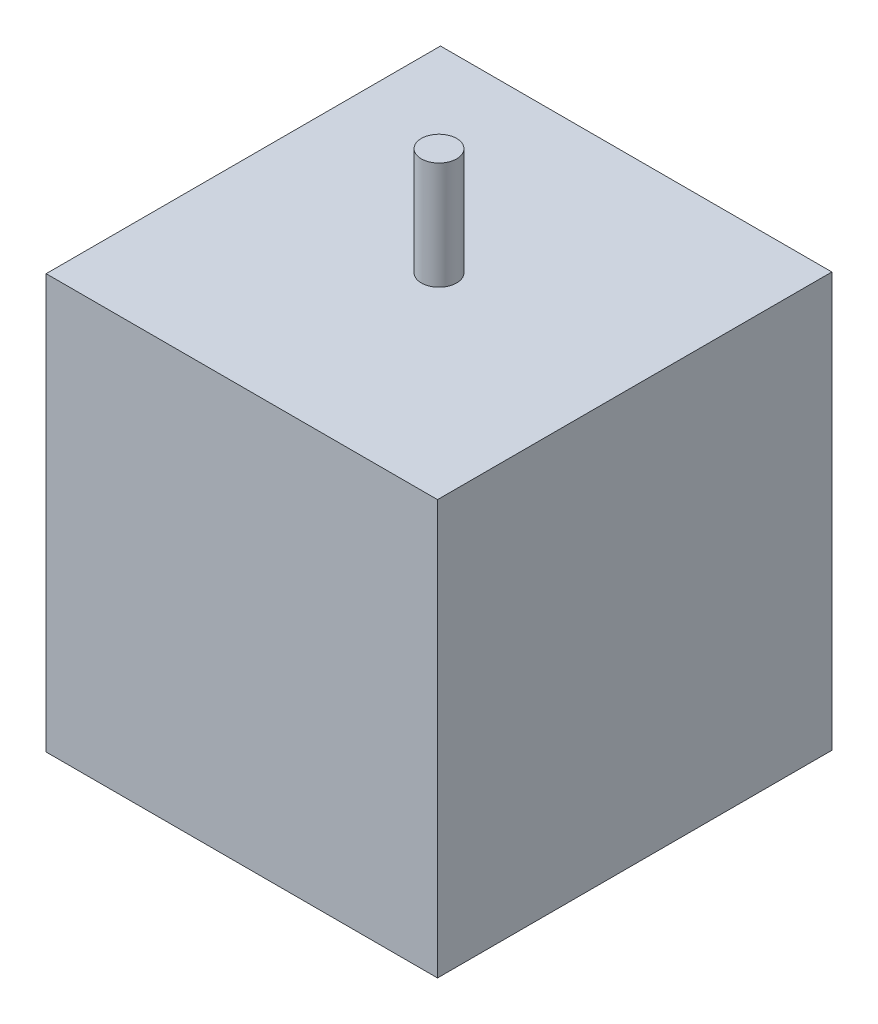
ISO-10303-21;
HEADER;
FILE_DESCRIPTION(('STEP AP214'),'2;1');
FILE_NAME('part.step','',(''),(''),'','','');
FILE_SCHEMA(('AUTOMOTIVE_DESIGN { 1 0 10303 214 1 1 1 1 }'));
ENDSEC;
DATA;
#1=APPLICATION_CONTEXT('core data for automotive mechanical design processes');
#2=APPLICATION_PROTOCOL_DEFINITION('international standard','automotive_design',2000,#1);
#3=PRODUCT_CONTEXT('',#1,'mechanical');
#4=PRODUCT('Part','Part','',(#3));
#5=PRODUCT_RELATED_PRODUCT_CATEGORY('part','',(#4));
#6=PRODUCT_DEFINITION_FORMATION('','',#4);
#7=PRODUCT_DEFINITION_CONTEXT('part definition',#1,'design');
#8=PRODUCT_DEFINITION('design','',#6,#7);
#9=PRODUCT_DEFINITION_SHAPE('','',#8);
#10=(LENGTH_UNIT() NAMED_UNIT(*) SI_UNIT(.MILLI.,.METRE.));
#11=(NAMED_UNIT(*) PLANE_ANGLE_UNIT() SI_UNIT($,.RADIAN.));
#12=(NAMED_UNIT(*) SI_UNIT($,.STERADIAN.) SOLID_ANGLE_UNIT());
#13=UNCERTAINTY_MEASURE_WITH_UNIT(LENGTH_MEASURE(1.E-05),#10,'distance_accuracy_value','');
#14=(GEOMETRIC_REPRESENTATION_CONTEXT(3) GLOBAL_UNCERTAINTY_ASSIGNED_CONTEXT((#13)) GLOBAL_UNIT_ASSIGNED_CONTEXT((#10,
#11,#12)) REPRESENTATION_CONTEXT('',''));
#15=CARTESIAN_POINT('',(0.,0.,0.));
#16=DIRECTION('',(0.,0.,1.));
#17=DIRECTION('',(1.,0.,0.));
#18=AXIS2_PLACEMENT_3D('',#15,#16,#17);
#19=CARTESIAN_POINT('',(49.8504423582809,115.560150299161,110.));
#20=DIRECTION('',(1.,0.,0.));
#21=DIRECTION('',(0.,1.,0.));
#22=AXIS2_PLACEMENT_3D('',#19,#20,#21);
#23=PLANE('',#22);
#24=DIRECTION('',(0.,-1.,0.));
#25=VECTOR('',#24,1.);
#26=CARTESIAN_POINT('',(49.8504423582809,115.560150299161,0.));
#27=LINE('',#26,#25);
#28=CARTESIAN_POINT('',(49.8504423582809,115.560150299161,0.));
#29=VERTEX_POINT('',#28);
#30=CARTESIAN_POINT('',(49.8504423582809,0.,0.));
#31=VERTEX_POINT('',#30);
#32=EDGE_CURVE('E109',#29,#31,#27,.T.);
#33=ORIENTED_EDGE('',*,*,#32,.T.);
#34=DIRECTION('',(0.,0.,-1.));
#35=VECTOR('',#34,1.);
#36=CARTESIAN_POINT('',(49.8504423582809,0.,110.));
#37=LINE('',#36,#35);
#38=CARTESIAN_POINT('',(49.8504423582809,0.,110.));
#39=VERTEX_POINT('',#38);
#40=EDGE_CURVE('E100',#39,#31,#37,.T.);
#41=ORIENTED_EDGE('',*,*,#40,.F.);
#42=DIRECTION('',(0.,-1.,0.));
#43=VECTOR('',#42,1.);
#44=CARTESIAN_POINT('',(49.8504423582809,115.560150299161,110.));
#45=LINE('',#44,#43);
#46=CARTESIAN_POINT('',(49.8504423582809,115.560150299161,110.));
#47=VERTEX_POINT('',#46);
#48=EDGE_CURVE('E94',#47,#39,#45,.T.);
#49=ORIENTED_EDGE('',*,*,#48,.F.);
#50=DIRECTION('',(0.,0.,-1.));
#51=VECTOR('',#50,1.);
#52=CARTESIAN_POINT('',(49.8504423582809,115.560150299161,110.));
#53=LINE('',#52,#51);
#54=EDGE_CURVE('E105',#47,#29,#53,.T.);
#55=ORIENTED_EDGE('',*,*,#54,.T.);
#56=EDGE_LOOP('',(#33,#41,#49,#55));
#57=FACE_BOUND('',#56,.T.);
#58=ADVANCED_FACE('F41',(#57),#23,.F.);
#59=CARTESIAN_POINT('',(49.8504423582809,0.,110.));
#60=DIRECTION('',(0.,1.,0.));
#61=DIRECTION('',(0.,0.,1.));
#62=AXIS2_PLACEMENT_3D('',#59,#60,#61);
#63=PLANE('',#62);
#64=CARTESIAN_POINT('',(104.436974974676,0.,55.));
#65=DIRECTION('',(0.,1.,0.));
#66=DIRECTION('',(0.,0.,1.));
#67=AXIS2_PLACEMENT_3D('',#64,#65,#66);
#68=CIRCLE('',#67,4.9273067198946);
#69=CARTESIAN_POINT('',(104.436974974676,0.,59.9273067198946));
#70=VERTEX_POINT('',#69);
#71=EDGE_CURVE('E11',#70,#70,#68,.F.);
#72=ORIENTED_EDGE('',*,*,#71,.F.);
#73=EDGE_LOOP('',(#72));
#74=FACE_BOUND('',#73,.T.);
#75=DIRECTION('',(1.,0.,0.));
#76=VECTOR('',#75,1.);
#77=CARTESIAN_POINT('',(49.8504423582809,0.,0.));
#78=LINE('',#77,#76);
#79=CARTESIAN_POINT('',(159.023507591071,0.,0.));
#80=VERTEX_POINT('',#79);
#81=EDGE_CURVE('E99',#31,#80,#78,.T.);
#82=ORIENTED_EDGE('',*,*,#81,.T.);
#83=DIRECTION('',(0.,0.,-1.));
#84=VECTOR('',#83,1.);
#85=CARTESIAN_POINT('',(159.023507591071,0.,110.));
#86=LINE('',#85,#84);
#87=CARTESIAN_POINT('',(159.023507591071,0.,110.));
#88=VERTEX_POINT('',#87);
#89=EDGE_CURVE('E97',#88,#80,#86,.T.);
#90=ORIENTED_EDGE('',*,*,#89,.F.);
#91=DIRECTION('',(1.,0.,0.));
#92=VECTOR('',#91,1.);
#93=CARTESIAN_POINT('',(49.8504423582809,0.,110.));
#94=LINE('',#93,#92);
#95=EDGE_CURVE('E89',#39,#88,#94,.T.);
#96=ORIENTED_EDGE('',*,*,#95,.F.);
#97=ORIENTED_EDGE('',*,*,#40,.T.);
#98=EDGE_LOOP('',(#82,#90,#96,#97));
#99=FACE_BOUND('',#98,.T.);
#100=ADVANCED_FACE('F98',(#74,#99),#63,.F.);
#101=CARTESIAN_POINT('',(159.023507591071,115.560150299161,110.));
#102=DIRECTION('',(-1.,0.,0.));
#103=DIRECTION('',(0.,0.,1.));
#104=AXIS2_PLACEMENT_3D('',#101,#102,#103);
#105=PLANE('',#104);
#106=DIRECTION('',(0.,1.,0.));
#107=VECTOR('',#106,1.);
#108=CARTESIAN_POINT('',(159.023507591071,115.560150299161,0.));
#109=LINE('',#108,#107);
#110=CARTESIAN_POINT('',(159.023507591071,115.560150299161,0.));
#111=VERTEX_POINT('',#110);
#112=EDGE_CURVE('E75',#80,#111,#109,.T.);
#113=ORIENTED_EDGE('',*,*,#112,.T.);
#114=DIRECTION('',(0.,0.,-1.));
#115=VECTOR('',#114,1.);
#116=CARTESIAN_POINT('',(159.023507591071,115.560150299161,110.));
#117=LINE('',#116,#115);
#118=CARTESIAN_POINT('',(159.023507591071,115.560150299161,110.));
#119=VERTEX_POINT('',#118);
#120=EDGE_CURVE('E101',#119,#111,#117,.T.);
#121=ORIENTED_EDGE('',*,*,#120,.F.);
#122=DIRECTION('',(0.,1.,0.));
#123=VECTOR('',#122,1.);
#124=CARTESIAN_POINT('',(159.023507591071,115.560150299161,110.));
#125=LINE('',#124,#123);
#126=EDGE_CURVE('E92',#88,#119,#125,.T.);
#127=ORIENTED_EDGE('',*,*,#126,.F.);
#128=ORIENTED_EDGE('',*,*,#89,.T.);
#129=EDGE_LOOP('',(#113,#121,#127,#128));
#130=FACE_BOUND('',#129,.T.);
#131=ADVANCED_FACE('F103',(#130),#105,.F.);
#132=CARTESIAN_POINT('',(49.8504423582809,115.560150299161,110.));
#133=DIRECTION('',(0.,-1.,0.));
#134=DIRECTION('',(0.,0.,-1.));
#135=AXIS2_PLACEMENT_3D('',#132,#133,#134);
#136=PLANE('',#135);
#137=CARTESIAN_POINT('',(104.436974974676,115.560150299161,55.));
#138=DIRECTION('',(0.,-1.,0.));
#139=DIRECTION('',(0.,0.,-1.));
#140=AXIS2_PLACEMENT_3D('',#137,#138,#139);
#141=CIRCLE('',#140,4.9273067198946);
#142=CARTESIAN_POINT('',(104.436974974676,115.560150299161,50.0726932801054));
#143=VERTEX_POINT('',#142);
#144=EDGE_CURVE('E44',#143,#143,#141,.F.);
#145=ORIENTED_EDGE('',*,*,#144,.F.);
#146=EDGE_LOOP('',(#145));
#147=FACE_BOUND('',#146,.T.);
#148=DIRECTION('',(-1.,0.,0.));
#149=VECTOR('',#148,1.);
#150=CARTESIAN_POINT('',(49.8504423582809,115.560150299161,0.));
#151=LINE('',#150,#149);
#152=EDGE_CURVE('E81',#111,#29,#151,.T.);
#153=ORIENTED_EDGE('',*,*,#152,.T.);
#154=ORIENTED_EDGE('',*,*,#54,.F.);
#155=DIRECTION('',(-1.,0.,0.));
#156=VECTOR('',#155,1.);
#157=CARTESIAN_POINT('',(49.8504423582809,115.560150299161,110.));
#158=LINE('',#157,#156);
#159=EDGE_CURVE('E58',#119,#47,#158,.T.);
#160=ORIENTED_EDGE('',*,*,#159,.F.);
#161=ORIENTED_EDGE('',*,*,#120,.T.);
#162=EDGE_LOOP('',(#153,#154,#160,#161));
#163=FACE_BOUND('',#162,.T.);
#164=ADVANCED_FACE('F122',(#147,#163),#136,.F.);
#165=CARTESIAN_POINT('',(0.,0.,110.));
#166=DIRECTION('',(0.,0.,1.));
#167=DIRECTION('',(1.,0.,0.));
#168=AXIS2_PLACEMENT_3D('',#165,#166,#167);
#169=PLANE('',#168);
#170=ORIENTED_EDGE('',*,*,#48,.T.);
#171=ORIENTED_EDGE('',*,*,#95,.T.);
#172=ORIENTED_EDGE('',*,*,#126,.T.);
#173=ORIENTED_EDGE('',*,*,#159,.T.);
#174=EDGE_LOOP('',(#170,#171,#172,#173));
#175=FACE_BOUND('',#174,.T.);
#176=ADVANCED_FACE('F90',(#175),#169,.T.);
#177=CARTESIAN_POINT('',(0.,0.,0.));
#178=DIRECTION('',(0.,0.,1.));
#179=DIRECTION('',(1.,0.,0.));
#180=AXIS2_PLACEMENT_3D('',#177,#178,#179);
#181=PLANE('',#180);
#182=ORIENTED_EDGE('',*,*,#32,.F.);
#183=ORIENTED_EDGE('',*,*,#152,.F.);
#184=ORIENTED_EDGE('',*,*,#112,.F.);
#185=ORIENTED_EDGE('',*,*,#81,.F.);
#186=EDGE_LOOP('',(#182,#183,#184,#185));
#187=FACE_BOUND('',#186,.T.);
#188=ADVANCED_FACE('F130',(#187),#181,.F.);
#189=CARTESIAN_POINT('',(104.436974974676,145.560150299161,55.));
#190=DIRECTION('',(0.,1.,0.));
#191=DIRECTION('',(0.,0.,1.));
#192=AXIS2_PLACEMENT_3D('',#189,#190,#191);
#193=PLANE('',#192);
#194=CARTESIAN_POINT('',(104.436974974676,145.560150299161,55.));
#195=DIRECTION('',(0.,1.,0.));
#196=DIRECTION('',(0.,0.,1.));
#197=AXIS2_PLACEMENT_3D('',#194,#195,#196);
#198=CIRCLE('',#197,4.9273067198946);
#199=CARTESIAN_POINT('',(104.436974974676,145.560150299161,59.9273067198946));
#200=VERTEX_POINT('',#199);
#201=EDGE_CURVE('E112',#200,#200,#198,.T.);
#202=ORIENTED_EDGE('',*,*,#201,.T.);
#203=EDGE_LOOP('',(#202));
#204=FACE_BOUND('',#203,.T.);
#205=ADVANCED_FACE('F143',(#204),#193,.T.);
#206=CARTESIAN_POINT('',(104.436974974676,145.560150299161,55.));
#207=DIRECTION('',(0.,-1.,0.));
#208=DIRECTION('',(0.,0.,-1.));
#209=AXIS2_PLACEMENT_3D('',#206,#207,#208);
#210=CYLINDRICAL_SURFACE('',#209,4.9273067198946);
#211=ORIENTED_EDGE('',*,*,#201,.F.);
#212=EDGE_LOOP('',(#211));
#213=FACE_BOUND('',#212,.T.);
#214=ORIENTED_EDGE('',*,*,#144,.T.);
#215=EDGE_LOOP('',(#214));
#216=FACE_BOUND('',#215,.T.);
#217=ADVANCED_FACE('F120',(#213,#216),#210,.T.);
#218=CARTESIAN_POINT('',(104.436974974676,-24.4398497008389,55.));
#219=DIRECTION('',(0.,1.,0.));
#220=DIRECTION('',(0.,0.,1.));
#221=AXIS2_PLACEMENT_3D('',#218,#219,#220);
#222=CIRCLE('',#221,4.9273067198946);
#223=CARTESIAN_POINT('',(104.436974974676,-24.4398497008389,59.9273067198946));
#224=VERTEX_POINT('',#223);
#225=EDGE_CURVE('E160',#224,#224,#222,.T.);
#226=ORIENTED_EDGE('',*,*,#225,.T.);
#227=EDGE_LOOP('',(#226));
#228=FACE_BOUND('',#227,.T.);
#229=ORIENTED_EDGE('',*,*,#71,.T.);
#230=EDGE_LOOP('',(#229));
#231=FACE_BOUND('',#230,.T.);
#232=ADVANCED_FACE('F149',(#228,#231),#210,.T.);
#233=CARTESIAN_POINT('',(104.436974974676,-24.4398497008389,55.));
#234=DIRECTION('',(0.,1.,0.));
#235=DIRECTION('',(0.,0.,1.));
#236=AXIS2_PLACEMENT_3D('',#233,#234,#235);
#237=PLANE('',#236);
#238=ORIENTED_EDGE('',*,*,#225,.F.);
#239=EDGE_LOOP('',(#238));
#240=FACE_BOUND('',#239,.T.);
#241=ADVANCED_FACE('F151',(#240),#237,.F.);
#242=CLOSED_SHELL('',(#58,#100,#131,#164,#176,#188,#205,#217,#232,#241));
#243=MANIFOLD_SOLID_BREP('B2',#242);
#244=ADVANCED_BREP_SHAPE_REPRESENTATION('',(#18,#243),#14);
#245=SHAPE_DEFINITION_REPRESENTATION(#9,#244);
ENDSEC;
END-ISO-10303-21;
